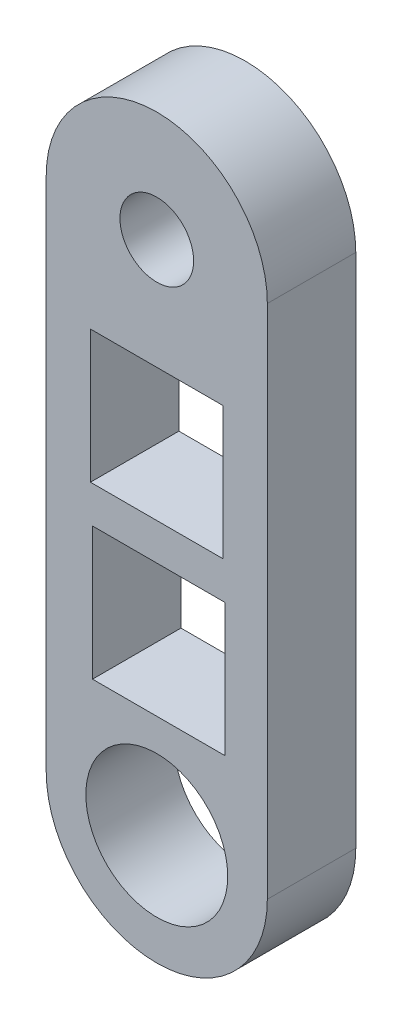
ISO-10303-21;
HEADER;
FILE_DESCRIPTION(('STEP AP214'),'2;1');
FILE_NAME('part.step','',(''),(''),'','','');
FILE_SCHEMA(('AUTOMOTIVE_DESIGN { 1 0 10303 214 1 1 1 1 }'));
ENDSEC;
DATA;
#1=APPLICATION_CONTEXT('core data for automotive mechanical design processes');
#2=APPLICATION_PROTOCOL_DEFINITION('international standard','automotive_design',2000,#1);
#3=PRODUCT_CONTEXT('',#1,'mechanical');
#4=PRODUCT('Part','Part','',(#3));
#5=PRODUCT_RELATED_PRODUCT_CATEGORY('part','',(#4));
#6=PRODUCT_DEFINITION_FORMATION('','',#4);
#7=PRODUCT_DEFINITION_CONTEXT('part definition',#1,'design');
#8=PRODUCT_DEFINITION('design','',#6,#7);
#9=PRODUCT_DEFINITION_SHAPE('','',#8);
#10=(LENGTH_UNIT() NAMED_UNIT(*) SI_UNIT(.MILLI.,.METRE.));
#11=(NAMED_UNIT(*) PLANE_ANGLE_UNIT() SI_UNIT($,.RADIAN.));
#12=(NAMED_UNIT(*) SI_UNIT($,.STERADIAN.) SOLID_ANGLE_UNIT());
#13=UNCERTAINTY_MEASURE_WITH_UNIT(LENGTH_MEASURE(1.E-05),#10,'distance_accuracy_value','');
#14=(GEOMETRIC_REPRESENTATION_CONTEXT(3) GLOBAL_UNCERTAINTY_ASSIGNED_CONTEXT((#13)) GLOBAL_UNIT_ASSIGNED_CONTEXT((#10,
#11,#12)) REPRESENTATION_CONTEXT('',''));
#15=CARTESIAN_POINT('',(0.,0.,0.));
#16=DIRECTION('',(0.,0.,1.));
#17=DIRECTION('',(1.,0.,0.));
#18=AXIS2_PLACEMENT_3D('',#15,#16,#17);
#19=CARTESIAN_POINT('',(0.,45.,12.));
#20=DIRECTION('',(0.,0.,1.));
#21=DIRECTION('',(1.,0.,0.));
#22=AXIS2_PLACEMENT_3D('',#19,#20,#21);
#23=PLANE('',#22);
#24=CARTESIAN_POINT('',(0.,-25.,12.));
#25=DIRECTION('',(0.,0.,1.));
#26=DIRECTION('',(1.,0.,0.));
#27=AXIS2_PLACEMENT_3D('',#24,#25,#26);
#28=CIRCLE('',#27,9.625);
#29=CARTESIAN_POINT('',(9.625,-25.,12.));
#30=VERTEX_POINT('',#29);
#31=EDGE_CURVE('E194',#30,#30,#28,.T.);
#32=ORIENTED_EDGE('',*,*,#31,.F.);
#33=EDGE_LOOP('',(#32));
#34=FACE_BOUND('',#33,.T.);
#35=CARTESIAN_POINT('',(0.,45.,12.));
#36=DIRECTION('',(0.,0.,1.));
#37=DIRECTION('',(1.,0.,0.));
#38=AXIS2_PLACEMENT_3D('',#35,#36,#37);
#39=CIRCLE('',#38,15.);
#40=CARTESIAN_POINT('',(15.,45.,12.));
#41=VERTEX_POINT('',#40);
#42=CARTESIAN_POINT('',(-15.,45.,12.));
#43=VERTEX_POINT('',#42);
#44=EDGE_CURVE('E200',#41,#43,#39,.T.);
#45=ORIENTED_EDGE('',*,*,#44,.T.);
#46=DIRECTION('',(0.,-1.,0.));
#47=VECTOR('',#46,1.);
#48=CARTESIAN_POINT('',(-15.,45.,12.));
#49=LINE('',#48,#47);
#50=CARTESIAN_POINT('',(-15.,-25.,12.));
#51=VERTEX_POINT('',#50);
#52=EDGE_CURVE('E203',#43,#51,#49,.T.);
#53=ORIENTED_EDGE('',*,*,#52,.T.);
#54=CARTESIAN_POINT('',(0.,-25.,12.));
#55=DIRECTION('',(0.,0.,1.));
#56=DIRECTION('',(1.,0.,0.));
#57=AXIS2_PLACEMENT_3D('',#54,#55,#56);
#58=CIRCLE('',#57,15.);
#59=CARTESIAN_POINT('',(15.,-25.,12.));
#60=VERTEX_POINT('',#59);
#61=EDGE_CURVE('E206',#51,#60,#58,.T.);
#62=ORIENTED_EDGE('',*,*,#61,.T.);
#63=DIRECTION('',(0.,1.,0.));
#64=VECTOR('',#63,1.);
#65=CARTESIAN_POINT('',(15.,45.,12.));
#66=LINE('',#65,#64);
#67=EDGE_CURVE('E208',#60,#41,#66,.T.);
#68=ORIENTED_EDGE('',*,*,#67,.T.);
#69=EDGE_LOOP('',(#45,#53,#62,#68));
#70=FACE_BOUND('',#69,.T.);
#71=CARTESIAN_POINT('',(0.,45.,12.));
#72=DIRECTION('',(0.,0.,1.));
#73=DIRECTION('',(1.,0.,0.));
#74=AXIS2_PLACEMENT_3D('',#71,#72,#73);
#75=CIRCLE('',#74,5.);
#76=CARTESIAN_POINT('',(5.,45.,12.));
#77=VERTEX_POINT('',#76);
#78=EDGE_CURVE('E188',#77,#77,#75,.T.);
#79=ORIENTED_EDGE('',*,*,#78,.F.);
#80=EDGE_LOOP('',(#79));
#81=FACE_BOUND('',#80,.T.);
#82=DIRECTION('',(1.,0.,0.));
#83=VECTOR('',#82,1.);
#84=CARTESIAN_POINT('',(-9.,12.,12.));
#85=LINE('',#84,#83);
#86=CARTESIAN_POINT('',(-9.,12.,12.));
#87=VERTEX_POINT('',#86);
#88=CARTESIAN_POINT('',(9.00000000000001,12.,12.));
#89=VERTEX_POINT('',#88);
#90=EDGE_CURVE('E159',#87,#89,#85,.T.);
#91=ORIENTED_EDGE('',*,*,#90,.F.);
#92=DIRECTION('',(0.,-1.,0.));
#93=VECTOR('',#92,1.);
#94=CARTESIAN_POINT('',(-9.,30.,12.));
#95=LINE('',#94,#93);
#96=CARTESIAN_POINT('',(-9.,30.,12.));
#97=VERTEX_POINT('',#96);
#98=EDGE_CURVE('E157',#97,#87,#95,.T.);
#99=ORIENTED_EDGE('',*,*,#98,.F.);
#100=DIRECTION('',(-1.,0.,0.));
#101=VECTOR('',#100,1.);
#102=CARTESIAN_POINT('',(-9.,30.,12.));
#103=LINE('',#102,#101);
#104=CARTESIAN_POINT('',(9.,30.,12.));
#105=VERTEX_POINT('',#104);
#106=EDGE_CURVE('E165',#105,#97,#103,.T.);
#107=ORIENTED_EDGE('',*,*,#106,.F.);
#108=DIRECTION('',(0.,1.,0.));
#109=VECTOR('',#108,1.);
#110=CARTESIAN_POINT('',(9.,30.,12.));
#111=LINE('',#110,#109);
#112=EDGE_CURVE('E162',#89,#105,#111,.T.);
#113=ORIENTED_EDGE('',*,*,#112,.F.);
#114=EDGE_LOOP('',(#91,#99,#107,#113));
#115=FACE_BOUND('',#114,.T.);
#116=DIRECTION('',(1.,0.,0.));
#117=VECTOR('',#116,1.);
#118=CARTESIAN_POINT('',(-8.71765503019412,-11.,12.));
#119=LINE('',#118,#117);
#120=CARTESIAN_POINT('',(-8.71765503019412,-11.,12.));
#121=VERTEX_POINT('',#120);
#122=CARTESIAN_POINT('',(9.28234496980588,-11.,12.));
#123=VERTEX_POINT('',#122);
#124=EDGE_CURVE('E129',#121,#123,#119,.T.);
#125=ORIENTED_EDGE('',*,*,#124,.F.);
#126=DIRECTION('',(0.,-1.,0.));
#127=VECTOR('',#126,1.);
#128=CARTESIAN_POINT('',(-8.71765503019412,7.,12.));
#129=LINE('',#128,#127);
#130=CARTESIAN_POINT('',(-8.71765503019412,7.,12.));
#131=VERTEX_POINT('',#130);
#132=EDGE_CURVE('E121',#131,#121,#129,.T.);
#133=ORIENTED_EDGE('',*,*,#132,.F.);
#134=DIRECTION('',(-1.,0.,0.));
#135=VECTOR('',#134,1.);
#136=CARTESIAN_POINT('',(-8.71765503019412,7.,12.));
#137=LINE('',#136,#135);
#138=CARTESIAN_POINT('',(9.28234496980588,7.,12.));
#139=VERTEX_POINT('',#138);
#140=EDGE_CURVE('E143',#139,#131,#137,.T.);
#141=ORIENTED_EDGE('',*,*,#140,.F.);
#142=DIRECTION('',(0.,1.,0.));
#143=VECTOR('',#142,1.);
#144=CARTESIAN_POINT('',(9.28234496980588,7.,12.));
#145=LINE('',#144,#143);
#146=EDGE_CURVE('E141',#123,#139,#145,.T.);
#147=ORIENTED_EDGE('',*,*,#146,.F.);
#148=EDGE_LOOP('',(#125,#133,#141,#147));
#149=FACE_BOUND('',#148,.T.);
#150=ADVANCED_FACE('F32',(#34,#70,#81,#115,#149),#23,.T.);
#151=CARTESIAN_POINT('',(0.,45.,0.));
#152=DIRECTION('',(0.,0.,1.));
#153=DIRECTION('',(1.,0.,0.));
#154=AXIS2_PLACEMENT_3D('',#151,#152,#153);
#155=PLANE('',#154);
#156=DIRECTION('',(0.,-1.,0.));
#157=VECTOR('',#156,1.);
#158=CARTESIAN_POINT('',(-9.,30.,0.));
#159=LINE('',#158,#157);
#160=CARTESIAN_POINT('',(-9.,30.,0.));
#161=VERTEX_POINT('',#160);
#162=CARTESIAN_POINT('',(-9.,12.,0.));
#163=VERTEX_POINT('',#162);
#164=EDGE_CURVE('E137',#161,#163,#159,.T.);
#165=ORIENTED_EDGE('',*,*,#164,.T.);
#166=DIRECTION('',(1.,0.,0.));
#167=VECTOR('',#166,1.);
#168=CARTESIAN_POINT('',(-9.,12.,0.));
#169=LINE('',#168,#167);
#170=CARTESIAN_POINT('',(9.00000000000001,12.,0.));
#171=VERTEX_POINT('',#170);
#172=EDGE_CURVE('E170',#163,#171,#169,.T.);
#173=ORIENTED_EDGE('',*,*,#172,.T.);
#174=DIRECTION('',(0.,1.,0.));
#175=VECTOR('',#174,1.);
#176=CARTESIAN_POINT('',(9.,30.,0.));
#177=LINE('',#176,#175);
#178=CARTESIAN_POINT('',(9.,30.,0.));
#179=VERTEX_POINT('',#178);
#180=EDGE_CURVE('E173',#171,#179,#177,.T.);
#181=ORIENTED_EDGE('',*,*,#180,.T.);
#182=DIRECTION('',(-1.,0.,0.));
#183=VECTOR('',#182,1.);
#184=CARTESIAN_POINT('',(-9.,30.,0.));
#185=LINE('',#184,#183);
#186=EDGE_CURVE('E160',#179,#161,#185,.T.);
#187=ORIENTED_EDGE('',*,*,#186,.T.);
#188=EDGE_LOOP('',(#165,#173,#181,#187));
#189=FACE_BOUND('',#188,.T.);
#190=CARTESIAN_POINT('',(0.,45.,0.));
#191=DIRECTION('',(0.,0.,1.));
#192=DIRECTION('',(1.,0.,0.));
#193=AXIS2_PLACEMENT_3D('',#190,#191,#192);
#194=CIRCLE('',#193,15.);
#195=CARTESIAN_POINT('',(15.,45.,0.));
#196=VERTEX_POINT('',#195);
#197=CARTESIAN_POINT('',(-15.,45.,0.));
#198=VERTEX_POINT('',#197);
#199=EDGE_CURVE('E197',#196,#198,#194,.T.);
#200=ORIENTED_EDGE('',*,*,#199,.F.);
#201=DIRECTION('',(0.,1.,0.));
#202=VECTOR('',#201,1.);
#203=CARTESIAN_POINT('',(15.,45.,0.));
#204=LINE('',#203,#202);
#205=CARTESIAN_POINT('',(15.,-25.,0.));
#206=VERTEX_POINT('',#205);
#207=EDGE_CURVE('E204',#206,#196,#204,.T.);
#208=ORIENTED_EDGE('',*,*,#207,.F.);
#209=CARTESIAN_POINT('',(0.,-25.,0.));
#210=DIRECTION('',(0.,0.,1.));
#211=DIRECTION('',(1.,0.,0.));
#212=AXIS2_PLACEMENT_3D('',#209,#210,#211);
#213=CIRCLE('',#212,15.);
#214=CARTESIAN_POINT('',(-15.,-25.,0.));
#215=VERTEX_POINT('',#214);
#216=EDGE_CURVE('E215',#215,#206,#213,.T.);
#217=ORIENTED_EDGE('',*,*,#216,.F.);
#218=DIRECTION('',(0.,-1.,0.));
#219=VECTOR('',#218,1.);
#220=CARTESIAN_POINT('',(-15.,45.,0.));
#221=LINE('',#220,#219);
#222=EDGE_CURVE('E213',#198,#215,#221,.T.);
#223=ORIENTED_EDGE('',*,*,#222,.F.);
#224=EDGE_LOOP('',(#200,#208,#217,#223));
#225=FACE_BOUND('',#224,.T.);
#226=CARTESIAN_POINT('',(0.,-25.,0.));
#227=DIRECTION('',(0.,0.,1.));
#228=DIRECTION('',(1.,0.,0.));
#229=AXIS2_PLACEMENT_3D('',#226,#227,#228);
#230=CIRCLE('',#229,9.625);
#231=CARTESIAN_POINT('',(9.625,-25.,0.));
#232=VERTEX_POINT('',#231);
#233=EDGE_CURVE('E191',#232,#232,#230,.T.);
#234=ORIENTED_EDGE('',*,*,#233,.T.);
#235=EDGE_LOOP('',(#234));
#236=FACE_BOUND('',#235,.T.);
#237=CARTESIAN_POINT('',(0.,45.,0.));
#238=DIRECTION('',(0.,0.,1.));
#239=DIRECTION('',(1.,0.,0.));
#240=AXIS2_PLACEMENT_3D('',#237,#238,#239);
#241=CIRCLE('',#240,5.);
#242=CARTESIAN_POINT('',(5.,45.,0.));
#243=VERTEX_POINT('',#242);
#244=EDGE_CURVE('E187',#243,#243,#241,.T.);
#245=ORIENTED_EDGE('',*,*,#244,.T.);
#246=EDGE_LOOP('',(#245));
#247=FACE_BOUND('',#246,.T.);
#248=DIRECTION('',(0.,-1.,0.));
#249=VECTOR('',#248,1.);
#250=CARTESIAN_POINT('',(-8.71765503019412,7.,0.));
#251=LINE('',#250,#249);
#252=CARTESIAN_POINT('',(-8.71765503019412,7.,0.));
#253=VERTEX_POINT('',#252);
#254=CARTESIAN_POINT('',(-8.71765503019412,-11.,0.));
#255=VERTEX_POINT('',#254);
#256=EDGE_CURVE('E55',#253,#255,#251,.T.);
#257=ORIENTED_EDGE('',*,*,#256,.T.);
#258=DIRECTION('',(1.,0.,0.));
#259=VECTOR('',#258,1.);
#260=CARTESIAN_POINT('',(-8.71765503019412,-11.,0.));
#261=LINE('',#260,#259);
#262=CARTESIAN_POINT('',(9.28234496980588,-11.,0.));
#263=VERTEX_POINT('',#262);
#264=EDGE_CURVE('E136',#255,#263,#261,.T.);
#265=ORIENTED_EDGE('',*,*,#264,.T.);
#266=DIRECTION('',(0.,1.,0.));
#267=VECTOR('',#266,1.);
#268=CARTESIAN_POINT('',(9.28234496980588,7.,0.));
#269=LINE('',#268,#267);
#270=CARTESIAN_POINT('',(9.28234496980588,7.,0.));
#271=VERTEX_POINT('',#270);
#272=EDGE_CURVE('E149',#263,#271,#269,.T.);
#273=ORIENTED_EDGE('',*,*,#272,.T.);
#274=DIRECTION('',(-1.,0.,0.));
#275=VECTOR('',#274,1.);
#276=CARTESIAN_POINT('',(-8.71765503019412,7.,0.));
#277=LINE('',#276,#275);
#278=EDGE_CURVE('E130',#271,#253,#277,.T.);
#279=ORIENTED_EDGE('',*,*,#278,.T.);
#280=EDGE_LOOP('',(#257,#265,#273,#279));
#281=FACE_BOUND('',#280,.T.);
#282=ADVANCED_FACE('F233',(#189,#225,#236,#247,#281),#155,.F.);
#283=CARTESIAN_POINT('',(0.,45.,12.));
#284=DIRECTION('',(0.,0.,-1.));
#285=DIRECTION('',(-1.,0.,0.));
#286=AXIS2_PLACEMENT_3D('',#283,#284,#285);
#287=CYLINDRICAL_SURFACE('',#286,15.);
#288=ORIENTED_EDGE('',*,*,#199,.T.);
#289=DIRECTION('',(0.,0.,-1.));
#290=VECTOR('',#289,1.);
#291=CARTESIAN_POINT('',(-15.,45.,12.));
#292=LINE('',#291,#290);
#293=EDGE_CURVE('E11',#43,#198,#292,.T.);
#294=ORIENTED_EDGE('',*,*,#293,.F.);
#295=ORIENTED_EDGE('',*,*,#44,.F.);
#296=DIRECTION('',(0.,0.,-1.));
#297=VECTOR('',#296,1.);
#298=CARTESIAN_POINT('',(15.,45.,12.));
#299=LINE('',#298,#297);
#300=EDGE_CURVE('E210',#41,#196,#299,.T.);
#301=ORIENTED_EDGE('',*,*,#300,.T.);
#302=EDGE_LOOP('',(#288,#294,#295,#301));
#303=FACE_BOUND('',#302,.T.);
#304=ADVANCED_FACE('F34',(#303),#287,.T.);
#305=CARTESIAN_POINT('',(-15.,45.,12.));
#306=DIRECTION('',(1.,0.,0.));
#307=DIRECTION('',(0.,1.,0.));
#308=AXIS2_PLACEMENT_3D('',#305,#306,#307);
#309=PLANE('',#308);
#310=ORIENTED_EDGE('',*,*,#222,.T.);
#311=DIRECTION('',(0.,0.,-1.));
#312=VECTOR('',#311,1.);
#313=CARTESIAN_POINT('',(-15.,-25.,12.));
#314=LINE('',#313,#312);
#315=EDGE_CURVE('E40',#51,#215,#314,.T.);
#316=ORIENTED_EDGE('',*,*,#315,.F.);
#317=ORIENTED_EDGE('',*,*,#52,.F.);
#318=ORIENTED_EDGE('',*,*,#293,.T.);
#319=EDGE_LOOP('',(#310,#316,#317,#318));
#320=FACE_BOUND('',#319,.T.);
#321=ADVANCED_FACE('F244',(#320),#309,.F.);
#322=CARTESIAN_POINT('',(0.,-25.,12.));
#323=DIRECTION('',(0.,0.,-1.));
#324=DIRECTION('',(-1.,0.,0.));
#325=AXIS2_PLACEMENT_3D('',#322,#323,#324);
#326=CYLINDRICAL_SURFACE('',#325,15.);
#327=ORIENTED_EDGE('',*,*,#216,.T.);
#328=DIRECTION('',(0.,0.,-1.));
#329=VECTOR('',#328,1.);
#330=CARTESIAN_POINT('',(15.,-25.,12.));
#331=LINE('',#330,#329);
#332=EDGE_CURVE('E220',#60,#206,#331,.T.);
#333=ORIENTED_EDGE('',*,*,#332,.F.);
#334=ORIENTED_EDGE('',*,*,#61,.F.);
#335=ORIENTED_EDGE('',*,*,#315,.T.);
#336=EDGE_LOOP('',(#327,#333,#334,#335));
#337=FACE_BOUND('',#336,.T.);
#338=ADVANCED_FACE('F227',(#337),#326,.T.);
#339=CARTESIAN_POINT('',(15.,45.,12.));
#340=DIRECTION('',(-1.,0.,0.));
#341=DIRECTION('',(0.,-1.,0.));
#342=AXIS2_PLACEMENT_3D('',#339,#340,#341);
#343=PLANE('',#342);
#344=ORIENTED_EDGE('',*,*,#207,.T.);
#345=ORIENTED_EDGE('',*,*,#300,.F.);
#346=ORIENTED_EDGE('',*,*,#67,.F.);
#347=ORIENTED_EDGE('',*,*,#332,.T.);
#348=EDGE_LOOP('',(#344,#345,#346,#347));
#349=FACE_BOUND('',#348,.T.);
#350=ADVANCED_FACE('F237',(#349),#343,.F.);
#351=CARTESIAN_POINT('',(0.,-25.,12.));
#352=DIRECTION('',(0.,0.,-1.));
#353=DIRECTION('',(-1.,0.,0.));
#354=AXIS2_PLACEMENT_3D('',#351,#352,#353);
#355=CYLINDRICAL_SURFACE('',#354,9.625);
#356=ORIENTED_EDGE('',*,*,#31,.T.);
#357=EDGE_LOOP('',(#356));
#358=FACE_BOUND('',#357,.T.);
#359=ORIENTED_EDGE('',*,*,#233,.F.);
#360=EDGE_LOOP('',(#359));
#361=FACE_BOUND('',#360,.T.);
#362=ADVANCED_FACE('F261',(#358,#361),#355,.F.);
#363=CARTESIAN_POINT('',(0.,45.,12.));
#364=DIRECTION('',(0.,0.,-1.));
#365=DIRECTION('',(-1.,0.,0.));
#366=AXIS2_PLACEMENT_3D('',#363,#364,#365);
#367=CYLINDRICAL_SURFACE('',#366,5.);
#368=ORIENTED_EDGE('',*,*,#78,.T.);
#369=EDGE_LOOP('',(#368));
#370=FACE_BOUND('',#369,.T.);
#371=ORIENTED_EDGE('',*,*,#244,.F.);
#372=EDGE_LOOP('',(#371));
#373=FACE_BOUND('',#372,.T.);
#374=ADVANCED_FACE('F268',(#370,#373),#367,.F.);
#375=CARTESIAN_POINT('',(-9.,30.,12.));
#376=DIRECTION('',(1.,0.,0.));
#377=DIRECTION('',(0.,1.,0.));
#378=AXIS2_PLACEMENT_3D('',#375,#376,#377);
#379=PLANE('',#378);
#380=ORIENTED_EDGE('',*,*,#164,.F.);
#381=DIRECTION('',(0.,0.,-1.));
#382=VECTOR('',#381,1.);
#383=CARTESIAN_POINT('',(-9.,30.,12.));
#384=LINE('',#383,#382);
#385=EDGE_CURVE('E167',#97,#161,#384,.T.);
#386=ORIENTED_EDGE('',*,*,#385,.F.);
#387=ORIENTED_EDGE('',*,*,#98,.T.);
#388=DIRECTION('',(0.,0.,-1.));
#389=VECTOR('',#388,1.);
#390=CARTESIAN_POINT('',(-9.,12.,12.));
#391=LINE('',#390,#389);
#392=EDGE_CURVE('E184',#87,#163,#391,.T.);
#393=ORIENTED_EDGE('',*,*,#392,.T.);
#394=EDGE_LOOP('',(#380,#386,#387,#393));
#395=FACE_BOUND('',#394,.T.);
#396=ADVANCED_FACE('F273',(#395),#379,.T.);
#397=CARTESIAN_POINT('',(-9.,12.,12.));
#398=DIRECTION('',(0.,1.,0.));
#399=DIRECTION('',(-1.,0.,0.));
#400=AXIS2_PLACEMENT_3D('',#397,#398,#399);
#401=PLANE('',#400);
#402=ORIENTED_EDGE('',*,*,#172,.F.);
#403=ORIENTED_EDGE('',*,*,#392,.F.);
#404=ORIENTED_EDGE('',*,*,#90,.T.);
#405=DIRECTION('',(0.,0.,-1.));
#406=VECTOR('',#405,1.);
#407=CARTESIAN_POINT('',(9.00000000000001,12.,12.));
#408=LINE('',#407,#406);
#409=EDGE_CURVE('E182',#89,#171,#408,.T.);
#410=ORIENTED_EDGE('',*,*,#409,.T.);
#411=EDGE_LOOP('',(#402,#403,#404,#410));
#412=FACE_BOUND('',#411,.T.);
#413=ADVANCED_FACE('F302',(#412),#401,.T.);
#414=CARTESIAN_POINT('',(9.,30.,12.));
#415=DIRECTION('',(-1.,0.,0.));
#416=DIRECTION('',(0.,-1.,0.));
#417=AXIS2_PLACEMENT_3D('',#414,#415,#416);
#418=PLANE('',#417);
#419=ORIENTED_EDGE('',*,*,#180,.F.);
#420=ORIENTED_EDGE('',*,*,#409,.F.);
#421=ORIENTED_EDGE('',*,*,#112,.T.);
#422=DIRECTION('',(0.,0.,-1.));
#423=VECTOR('',#422,1.);
#424=CARTESIAN_POINT('',(9.,30.,12.));
#425=LINE('',#424,#423);
#426=EDGE_CURVE('E180',#105,#179,#425,.T.);
#427=ORIENTED_EDGE('',*,*,#426,.T.);
#428=EDGE_LOOP('',(#419,#420,#421,#427));
#429=FACE_BOUND('',#428,.T.);
#430=ADVANCED_FACE('F298',(#429),#418,.T.);
#431=CARTESIAN_POINT('',(-9.,30.,12.));
#432=DIRECTION('',(0.,-1.,0.));
#433=DIRECTION('',(0.,0.,-1.));
#434=AXIS2_PLACEMENT_3D('',#431,#432,#433);
#435=PLANE('',#434);
#436=ORIENTED_EDGE('',*,*,#186,.F.);
#437=ORIENTED_EDGE('',*,*,#426,.F.);
#438=ORIENTED_EDGE('',*,*,#106,.T.);
#439=ORIENTED_EDGE('',*,*,#385,.T.);
#440=EDGE_LOOP('',(#436,#437,#438,#439));
#441=FACE_BOUND('',#440,.T.);
#442=ADVANCED_FACE('F295',(#441),#435,.T.);
#443=CARTESIAN_POINT('',(-8.71765503019412,7.,12.));
#444=DIRECTION('',(1.,0.,0.));
#445=DIRECTION('',(0.,0.,-1.));
#446=AXIS2_PLACEMENT_3D('',#443,#444,#445);
#447=PLANE('',#446);
#448=ORIENTED_EDGE('',*,*,#256,.F.);
#449=DIRECTION('',(0.,0.,-1.));
#450=VECTOR('',#449,1.);
#451=CARTESIAN_POINT('',(-8.71765503019412,7.,12.));
#452=LINE('',#451,#450);
#453=EDGE_CURVE('E125',#131,#253,#452,.T.);
#454=ORIENTED_EDGE('',*,*,#453,.F.);
#455=ORIENTED_EDGE('',*,*,#132,.T.);
#456=DIRECTION('',(0.,0.,-1.));
#457=VECTOR('',#456,1.);
#458=CARTESIAN_POINT('',(-8.71765503019412,-11.,12.));
#459=LINE('',#458,#457);
#460=EDGE_CURVE('E124',#121,#255,#459,.T.);
#461=ORIENTED_EDGE('',*,*,#460,.T.);
#462=EDGE_LOOP('',(#448,#454,#455,#461));
#463=FACE_BOUND('',#462,.T.);
#464=ADVANCED_FACE('F123',(#463),#447,.T.);
#465=CARTESIAN_POINT('',(-8.71765503019412,-11.,12.));
#466=DIRECTION('',(0.,1.,0.));
#467=DIRECTION('',(0.,0.,1.));
#468=AXIS2_PLACEMENT_3D('',#465,#466,#467);
#469=PLANE('',#468);
#470=ORIENTED_EDGE('',*,*,#264,.F.);
#471=ORIENTED_EDGE('',*,*,#460,.F.);
#472=ORIENTED_EDGE('',*,*,#124,.T.);
#473=DIRECTION('',(0.,0.,-1.));
#474=VECTOR('',#473,1.);
#475=CARTESIAN_POINT('',(9.28234496980588,-11.,12.));
#476=LINE('',#475,#474);
#477=EDGE_CURVE('E138',#123,#263,#476,.T.);
#478=ORIENTED_EDGE('',*,*,#477,.T.);
#479=EDGE_LOOP('',(#470,#471,#472,#478));
#480=FACE_BOUND('',#479,.T.);
#481=ADVANCED_FACE('F133',(#480),#469,.T.);
#482=CARTESIAN_POINT('',(9.28234496980588,7.,12.));
#483=DIRECTION('',(-1.,0.,0.));
#484=DIRECTION('',(0.,0.,1.));
#485=AXIS2_PLACEMENT_3D('',#482,#483,#484);
#486=PLANE('',#485);
#487=ORIENTED_EDGE('',*,*,#272,.F.);
#488=ORIENTED_EDGE('',*,*,#477,.F.);
#489=ORIENTED_EDGE('',*,*,#146,.T.);
#490=DIRECTION('',(0.,0.,-1.));
#491=VECTOR('',#490,1.);
#492=CARTESIAN_POINT('',(9.28234496980588,7.,12.));
#493=LINE('',#492,#491);
#494=EDGE_CURVE('E47',#139,#271,#493,.T.);
#495=ORIENTED_EDGE('',*,*,#494,.T.);
#496=EDGE_LOOP('',(#487,#488,#489,#495));
#497=FACE_BOUND('',#496,.T.);
#498=ADVANCED_FACE('F283',(#497),#486,.T.);
#499=CARTESIAN_POINT('',(-8.71765503019412,7.,12.));
#500=DIRECTION('',(0.,-1.,0.));
#501=DIRECTION('',(0.,0.,-1.));
#502=AXIS2_PLACEMENT_3D('',#499,#500,#501);
#503=PLANE('',#502);
#504=ORIENTED_EDGE('',*,*,#278,.F.);
#505=ORIENTED_EDGE('',*,*,#494,.F.);
#506=ORIENTED_EDGE('',*,*,#140,.T.);
#507=ORIENTED_EDGE('',*,*,#453,.T.);
#508=EDGE_LOOP('',(#504,#505,#506,#507));
#509=FACE_BOUND('',#508,.T.);
#510=ADVANCED_FACE('F281',(#509),#503,.T.);
#511=CLOSED_SHELL('',(#150,#282,#304,#321,#338,#350,#362,#374,#396,#413,#430,#442,#464,#481,
#498,#510));
#512=MANIFOLD_SOLID_BREP('B2',#511);
#513=ADVANCED_BREP_SHAPE_REPRESENTATION('',(#18,#512),#14);
#514=SHAPE_DEFINITION_REPRESENTATION(#9,#513);
ENDSEC;
END-ISO-10303-21;
